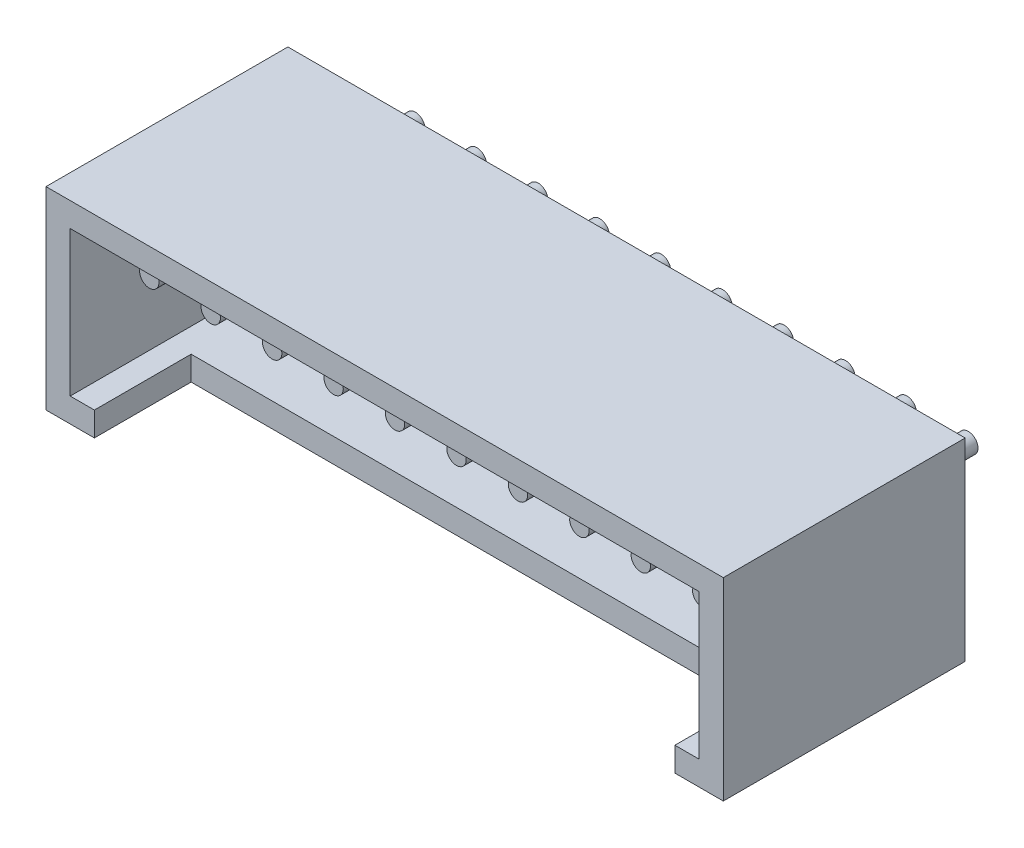
ISO-10303-21;
HEADER;
FILE_DESCRIPTION(('STEP AP214'),'2;1');
FILE_NAME('part.step','',(''),(''),'','','');
FILE_SCHEMA(('AUTOMOTIVE_DESIGN { 1 0 10303 214 1 1 1 1 }'));
ENDSEC;
DATA;
#1=APPLICATION_CONTEXT('core data for automotive mechanical design processes');
#2=APPLICATION_PROTOCOL_DEFINITION('international standard','automotive_design',2000,#1);
#3=PRODUCT_CONTEXT('',#1,'mechanical');
#4=PRODUCT('Part','Part','',(#3));
#5=PRODUCT_RELATED_PRODUCT_CATEGORY('part','',(#4));
#6=PRODUCT_DEFINITION_FORMATION('','',#4);
#7=PRODUCT_DEFINITION_CONTEXT('part definition',#1,'design');
#8=PRODUCT_DEFINITION('design','',#6,#7);
#9=PRODUCT_DEFINITION_SHAPE('','',#8);
#10=(LENGTH_UNIT() NAMED_UNIT(*) SI_UNIT(.MILLI.,.METRE.));
#11=(NAMED_UNIT(*) PLANE_ANGLE_UNIT() SI_UNIT($,.RADIAN.));
#12=(NAMED_UNIT(*) SI_UNIT($,.STERADIAN.) SOLID_ANGLE_UNIT());
#13=UNCERTAINTY_MEASURE_WITH_UNIT(LENGTH_MEASURE(1.E-05),#10,'distance_accuracy_value','');
#14=(GEOMETRIC_REPRESENTATION_CONTEXT(3) GLOBAL_UNCERTAINTY_ASSIGNED_CONTEXT((#13)) GLOBAL_UNIT_ASSIGNED_CONTEXT((#10,
#11,#12)) REPRESENTATION_CONTEXT('',''));
#15=CARTESIAN_POINT('',(0.,0.,0.));
#16=DIRECTION('',(0.,0.,1.));
#17=DIRECTION('',(1.,0.,0.));
#18=AXIS2_PLACEMENT_3D('',#15,#16,#17);
#19=CARTESIAN_POINT('',(12.715,2.6,4.15));
#20=DIRECTION('',(0.,0.,-1.));
#21=DIRECTION('',(-1.,0.,0.));
#22=AXIS2_PLACEMENT_3D('',#19,#20,#21);
#23=CYLINDRICAL_SURFACE('',#22,0.2);
#24=CARTESIAN_POINT('',(12.715,2.6,1.4));
#25=DIRECTION('',(0.,0.,1.));
#26=DIRECTION('',(1.,0.,0.));
#27=AXIS2_PLACEMENT_3D('',#24,#25,#26);
#28=CIRCLE('',#27,0.2);
#29=CARTESIAN_POINT('',(12.915,2.6,1.4));
#30=VERTEX_POINT('',#29);
#31=EDGE_CURVE('E42',#30,#30,#28,.F.);
#32=ORIENTED_EDGE('',*,*,#31,.F.);
#33=EDGE_LOOP('',(#32));
#34=FACE_BOUND('',#33,.T.);
#35=CARTESIAN_POINT('',(12.715,2.6,4.15));
#36=DIRECTION('',(0.,0.,1.));
#37=DIRECTION('',(1.,0.,0.));
#38=AXIS2_PLACEMENT_3D('',#35,#36,#37);
#39=CIRCLE('',#38,0.2);
#40=CARTESIAN_POINT('',(12.915,2.6,4.15));
#41=VERTEX_POINT('',#40);
#42=EDGE_CURVE('E11',#41,#41,#39,.T.);
#43=ORIENTED_EDGE('',*,*,#42,.F.);
#44=EDGE_LOOP('',(#43));
#45=FACE_BOUND('',#44,.T.);
#46=ADVANCED_FACE('F35',(#34,#45),#23,.T.);
#47=CARTESIAN_POINT('',(12.715,2.6,4.15));
#48=DIRECTION('',(0.,0.,1.));
#49=DIRECTION('',(1.,0.,0.));
#50=AXIS2_PLACEMENT_3D('',#47,#48,#49);
#51=PLANE('',#50);
#52=ORIENTED_EDGE('',*,*,#42,.T.);
#53=EDGE_LOOP('',(#52));
#54=FACE_BOUND('',#53,.T.);
#55=ADVANCED_FACE('F279',(#54),#51,.T.);
#56=CARTESIAN_POINT('',(11.445,2.6,4.15));
#57=DIRECTION('',(0.,0.,-1.));
#58=DIRECTION('',(-1.,0.,0.));
#59=AXIS2_PLACEMENT_3D('',#56,#57,#58);
#60=CYLINDRICAL_SURFACE('',#59,0.2);
#61=CARTESIAN_POINT('',(11.445,2.6,1.4));
#62=DIRECTION('',(0.,0.,1.));
#63=DIRECTION('',(1.,0.,0.));
#64=AXIS2_PLACEMENT_3D('',#61,#62,#63);
#65=CIRCLE('',#64,0.2);
#66=CARTESIAN_POINT('',(11.645,2.6,1.4));
#67=VERTEX_POINT('',#66);
#68=EDGE_CURVE('E267',#67,#67,#65,.F.);
#69=ORIENTED_EDGE('',*,*,#68,.F.);
#70=EDGE_LOOP('',(#69));
#71=FACE_BOUND('',#70,.T.);
#72=CARTESIAN_POINT('',(11.445,2.6,4.15));
#73=DIRECTION('',(0.,0.,1.));
#74=DIRECTION('',(1.,0.,0.));
#75=AXIS2_PLACEMENT_3D('',#72,#73,#74);
#76=CIRCLE('',#75,0.2);
#77=CARTESIAN_POINT('',(11.645,2.6,4.15));
#78=VERTEX_POINT('',#77);
#79=EDGE_CURVE('E270',#78,#78,#76,.T.);
#80=ORIENTED_EDGE('',*,*,#79,.F.);
#81=EDGE_LOOP('',(#80));
#82=FACE_BOUND('',#81,.T.);
#83=ADVANCED_FACE('F283',(#71,#82),#60,.T.);
#84=CARTESIAN_POINT('',(11.445,2.6,4.15));
#85=DIRECTION('',(0.,0.,1.));
#86=DIRECTION('',(1.,0.,0.));
#87=AXIS2_PLACEMENT_3D('',#84,#85,#86);
#88=PLANE('',#87);
#89=ORIENTED_EDGE('',*,*,#79,.T.);
#90=EDGE_LOOP('',(#89));
#91=FACE_BOUND('',#90,.T.);
#92=ADVANCED_FACE('F287',(#91),#88,.T.);
#93=CARTESIAN_POINT('',(10.175,2.6,4.15));
#94=DIRECTION('',(0.,0.,-1.));
#95=DIRECTION('',(-1.,0.,0.));
#96=AXIS2_PLACEMENT_3D('',#93,#94,#95);
#97=CYLINDRICAL_SURFACE('',#96,0.2);
#98=CARTESIAN_POINT('',(10.175,2.6,1.4));
#99=DIRECTION('',(0.,0.,1.));
#100=DIRECTION('',(1.,0.,0.));
#101=AXIS2_PLACEMENT_3D('',#98,#99,#100);
#102=CIRCLE('',#101,0.2);
#103=CARTESIAN_POINT('',(10.375,2.6,1.4));
#104=VERTEX_POINT('',#103);
#105=EDGE_CURVE('E261',#104,#104,#102,.F.);
#106=ORIENTED_EDGE('',*,*,#105,.F.);
#107=EDGE_LOOP('',(#106));
#108=FACE_BOUND('',#107,.T.);
#109=CARTESIAN_POINT('',(10.175,2.6,4.15));
#110=DIRECTION('',(0.,0.,1.));
#111=DIRECTION('',(1.,0.,0.));
#112=AXIS2_PLACEMENT_3D('',#109,#110,#111);
#113=CIRCLE('',#112,0.2);
#114=CARTESIAN_POINT('',(10.375,2.6,4.15));
#115=VERTEX_POINT('',#114);
#116=EDGE_CURVE('E264',#115,#115,#113,.T.);
#117=ORIENTED_EDGE('',*,*,#116,.F.);
#118=EDGE_LOOP('',(#117));
#119=FACE_BOUND('',#118,.T.);
#120=ADVANCED_FACE('F293',(#108,#119),#97,.T.);
#121=CARTESIAN_POINT('',(10.175,2.6,4.15));
#122=DIRECTION('',(0.,0.,1.));
#123=DIRECTION('',(1.,0.,0.));
#124=AXIS2_PLACEMENT_3D('',#121,#122,#123);
#125=PLANE('',#124);
#126=ORIENTED_EDGE('',*,*,#116,.T.);
#127=EDGE_LOOP('',(#126));
#128=FACE_BOUND('',#127,.T.);
#129=ADVANCED_FACE('F297',(#128),#125,.T.);
#130=CARTESIAN_POINT('',(8.905,2.6,4.15));
#131=DIRECTION('',(0.,0.,-1.));
#132=DIRECTION('',(-1.,0.,0.));
#133=AXIS2_PLACEMENT_3D('',#130,#131,#132);
#134=CYLINDRICAL_SURFACE('',#133,0.2);
#135=CARTESIAN_POINT('',(8.905,2.6,1.4));
#136=DIRECTION('',(0.,0.,1.));
#137=DIRECTION('',(1.,0.,0.));
#138=AXIS2_PLACEMENT_3D('',#135,#136,#137);
#139=CIRCLE('',#138,0.2);
#140=CARTESIAN_POINT('',(9.105,2.6,1.4));
#141=VERTEX_POINT('',#140);
#142=EDGE_CURVE('E255',#141,#141,#139,.F.);
#143=ORIENTED_EDGE('',*,*,#142,.F.);
#144=EDGE_LOOP('',(#143));
#145=FACE_BOUND('',#144,.T.);
#146=CARTESIAN_POINT('',(8.905,2.6,4.15));
#147=DIRECTION('',(0.,0.,1.));
#148=DIRECTION('',(1.,0.,0.));
#149=AXIS2_PLACEMENT_3D('',#146,#147,#148);
#150=CIRCLE('',#149,0.2);
#151=CARTESIAN_POINT('',(9.105,2.6,4.15));
#152=VERTEX_POINT('',#151);
#153=EDGE_CURVE('E258',#152,#152,#150,.T.);
#154=ORIENTED_EDGE('',*,*,#153,.F.);
#155=EDGE_LOOP('',(#154));
#156=FACE_BOUND('',#155,.T.);
#157=ADVANCED_FACE('F301',(#145,#156),#134,.T.);
#158=CARTESIAN_POINT('',(8.905,2.6,4.15));
#159=DIRECTION('',(0.,0.,1.));
#160=DIRECTION('',(1.,0.,0.));
#161=AXIS2_PLACEMENT_3D('',#158,#159,#160);
#162=PLANE('',#161);
#163=ORIENTED_EDGE('',*,*,#153,.T.);
#164=EDGE_LOOP('',(#163));
#165=FACE_BOUND('',#164,.T.);
#166=ADVANCED_FACE('F305',(#165),#162,.T.);
#167=CARTESIAN_POINT('',(7.635,2.6,4.15));
#168=DIRECTION('',(0.,0.,-1.));
#169=DIRECTION('',(-1.,0.,0.));
#170=AXIS2_PLACEMENT_3D('',#167,#168,#169);
#171=CYLINDRICAL_SURFACE('',#170,0.2);
#172=CARTESIAN_POINT('',(7.635,2.6,1.4));
#173=DIRECTION('',(0.,0.,1.));
#174=DIRECTION('',(1.,0.,0.));
#175=AXIS2_PLACEMENT_3D('',#172,#173,#174);
#176=CIRCLE('',#175,0.2);
#177=CARTESIAN_POINT('',(7.835,2.6,1.4));
#178=VERTEX_POINT('',#177);
#179=EDGE_CURVE('E249',#178,#178,#176,.F.);
#180=ORIENTED_EDGE('',*,*,#179,.F.);
#181=EDGE_LOOP('',(#180));
#182=FACE_BOUND('',#181,.T.);
#183=CARTESIAN_POINT('',(7.635,2.6,4.15));
#184=DIRECTION('',(0.,0.,1.));
#185=DIRECTION('',(1.,0.,0.));
#186=AXIS2_PLACEMENT_3D('',#183,#184,#185);
#187=CIRCLE('',#186,0.2);
#188=CARTESIAN_POINT('',(7.835,2.6,4.15));
#189=VERTEX_POINT('',#188);
#190=EDGE_CURVE('E252',#189,#189,#187,.T.);
#191=ORIENTED_EDGE('',*,*,#190,.F.);
#192=EDGE_LOOP('',(#191));
#193=FACE_BOUND('',#192,.T.);
#194=ADVANCED_FACE('F309',(#182,#193),#171,.T.);
#195=CARTESIAN_POINT('',(7.635,2.6,4.15));
#196=DIRECTION('',(0.,0.,1.));
#197=DIRECTION('',(1.,0.,0.));
#198=AXIS2_PLACEMENT_3D('',#195,#196,#197);
#199=PLANE('',#198);
#200=ORIENTED_EDGE('',*,*,#190,.T.);
#201=EDGE_LOOP('',(#200));
#202=FACE_BOUND('',#201,.T.);
#203=ADVANCED_FACE('F313',(#202),#199,.T.);
#204=CARTESIAN_POINT('',(6.365,2.6,4.15));
#205=DIRECTION('',(0.,0.,-1.));
#206=DIRECTION('',(-1.,0.,0.));
#207=AXIS2_PLACEMENT_3D('',#204,#205,#206);
#208=CYLINDRICAL_SURFACE('',#207,0.2);
#209=CARTESIAN_POINT('',(6.365,2.6,1.4));
#210=DIRECTION('',(0.,0.,1.));
#211=DIRECTION('',(1.,0.,0.));
#212=AXIS2_PLACEMENT_3D('',#209,#210,#211);
#213=CIRCLE('',#212,0.2);
#214=CARTESIAN_POINT('',(6.565,2.6,1.4));
#215=VERTEX_POINT('',#214);
#216=EDGE_CURVE('E243',#215,#215,#213,.F.);
#217=ORIENTED_EDGE('',*,*,#216,.F.);
#218=EDGE_LOOP('',(#217));
#219=FACE_BOUND('',#218,.T.);
#220=CARTESIAN_POINT('',(6.365,2.6,4.15));
#221=DIRECTION('',(0.,0.,1.));
#222=DIRECTION('',(1.,0.,0.));
#223=AXIS2_PLACEMENT_3D('',#220,#221,#222);
#224=CIRCLE('',#223,0.2);
#225=CARTESIAN_POINT('',(6.565,2.6,4.15));
#226=VERTEX_POINT('',#225);
#227=EDGE_CURVE('E246',#226,#226,#224,.T.);
#228=ORIENTED_EDGE('',*,*,#227,.F.);
#229=EDGE_LOOP('',(#228));
#230=FACE_BOUND('',#229,.T.);
#231=ADVANCED_FACE('F317',(#219,#230),#208,.T.);
#232=CARTESIAN_POINT('',(6.365,2.6,4.15));
#233=DIRECTION('',(0.,0.,1.));
#234=DIRECTION('',(1.,0.,0.));
#235=AXIS2_PLACEMENT_3D('',#232,#233,#234);
#236=PLANE('',#235);
#237=ORIENTED_EDGE('',*,*,#227,.T.);
#238=EDGE_LOOP('',(#237));
#239=FACE_BOUND('',#238,.T.);
#240=ADVANCED_FACE('F321',(#239),#236,.T.);
#241=CARTESIAN_POINT('',(5.095,2.6,4.15));
#242=DIRECTION('',(0.,0.,-1.));
#243=DIRECTION('',(-1.,0.,0.));
#244=AXIS2_PLACEMENT_3D('',#241,#242,#243);
#245=CYLINDRICAL_SURFACE('',#244,0.2);
#246=CARTESIAN_POINT('',(5.095,2.6,1.4));
#247=DIRECTION('',(0.,0.,1.));
#248=DIRECTION('',(1.,0.,0.));
#249=AXIS2_PLACEMENT_3D('',#246,#247,#248);
#250=CIRCLE('',#249,0.2);
#251=CARTESIAN_POINT('',(5.295,2.6,1.4));
#252=VERTEX_POINT('',#251);
#253=EDGE_CURVE('E237',#252,#252,#250,.F.);
#254=ORIENTED_EDGE('',*,*,#253,.F.);
#255=EDGE_LOOP('',(#254));
#256=FACE_BOUND('',#255,.T.);
#257=CARTESIAN_POINT('',(5.095,2.6,4.15));
#258=DIRECTION('',(0.,0.,1.));
#259=DIRECTION('',(1.,0.,0.));
#260=AXIS2_PLACEMENT_3D('',#257,#258,#259);
#261=CIRCLE('',#260,0.2);
#262=CARTESIAN_POINT('',(5.295,2.6,4.15));
#263=VERTEX_POINT('',#262);
#264=EDGE_CURVE('E240',#263,#263,#261,.T.);
#265=ORIENTED_EDGE('',*,*,#264,.F.);
#266=EDGE_LOOP('',(#265));
#267=FACE_BOUND('',#266,.T.);
#268=ADVANCED_FACE('F325',(#256,#267),#245,.T.);
#269=CARTESIAN_POINT('',(5.095,2.6,4.15));
#270=DIRECTION('',(0.,0.,1.));
#271=DIRECTION('',(1.,0.,0.));
#272=AXIS2_PLACEMENT_3D('',#269,#270,#271);
#273=PLANE('',#272);
#274=ORIENTED_EDGE('',*,*,#264,.T.);
#275=EDGE_LOOP('',(#274));
#276=FACE_BOUND('',#275,.T.);
#277=ADVANCED_FACE('F329',(#276),#273,.T.);
#278=CARTESIAN_POINT('',(3.825,2.6,4.15));
#279=DIRECTION('',(0.,0.,-1.));
#280=DIRECTION('',(-1.,0.,0.));
#281=AXIS2_PLACEMENT_3D('',#278,#279,#280);
#282=CYLINDRICAL_SURFACE('',#281,0.2);
#283=CARTESIAN_POINT('',(3.825,2.6,1.4));
#284=DIRECTION('',(0.,0.,1.));
#285=DIRECTION('',(1.,0.,0.));
#286=AXIS2_PLACEMENT_3D('',#283,#284,#285);
#287=CIRCLE('',#286,0.2);
#288=CARTESIAN_POINT('',(4.025,2.6,1.4));
#289=VERTEX_POINT('',#288);
#290=EDGE_CURVE('E231',#289,#289,#287,.F.);
#291=ORIENTED_EDGE('',*,*,#290,.F.);
#292=EDGE_LOOP('',(#291));
#293=FACE_BOUND('',#292,.T.);
#294=CARTESIAN_POINT('',(3.825,2.6,4.15));
#295=DIRECTION('',(0.,0.,1.));
#296=DIRECTION('',(1.,0.,0.));
#297=AXIS2_PLACEMENT_3D('',#294,#295,#296);
#298=CIRCLE('',#297,0.2);
#299=CARTESIAN_POINT('',(4.025,2.6,4.15));
#300=VERTEX_POINT('',#299);
#301=EDGE_CURVE('E234',#300,#300,#298,.T.);
#302=ORIENTED_EDGE('',*,*,#301,.F.);
#303=EDGE_LOOP('',(#302));
#304=FACE_BOUND('',#303,.T.);
#305=ADVANCED_FACE('F333',(#293,#304),#282,.T.);
#306=CARTESIAN_POINT('',(3.825,2.6,4.15));
#307=DIRECTION('',(0.,0.,1.));
#308=DIRECTION('',(1.,0.,0.));
#309=AXIS2_PLACEMENT_3D('',#306,#307,#308);
#310=PLANE('',#309);
#311=ORIENTED_EDGE('',*,*,#301,.T.);
#312=EDGE_LOOP('',(#311));
#313=FACE_BOUND('',#312,.T.);
#314=ADVANCED_FACE('F337',(#313),#310,.T.);
#315=CARTESIAN_POINT('',(12.715,2.6,-1.35));
#316=DIRECTION('',(0.,0.,1.));
#317=DIRECTION('',(1.,0.,0.));
#318=AXIS2_PLACEMENT_3D('',#315,#316,#317);
#319=PLANE('',#318);
#320=CARTESIAN_POINT('',(12.715,2.6,-1.35));
#321=DIRECTION('',(0.,0.,1.));
#322=DIRECTION('',(1.,0.,0.));
#323=AXIS2_PLACEMENT_3D('',#320,#321,#322);
#324=CIRCLE('',#323,0.2);
#325=CARTESIAN_POINT('',(12.915,2.6,-1.35));
#326=VERTEX_POINT('',#325);
#327=EDGE_CURVE('E228',#326,#326,#324,.T.);
#328=ORIENTED_EDGE('',*,*,#327,.F.);
#329=EDGE_LOOP('',(#328));
#330=FACE_BOUND('',#329,.T.);
#331=ADVANCED_FACE('F341',(#330),#319,.F.);
#332=CARTESIAN_POINT('',(12.715,2.6,4.15));
#333=DIRECTION('',(0.,0.,-1.));
#334=DIRECTION('',(-1.,0.,0.));
#335=AXIS2_PLACEMENT_3D('',#332,#333,#334);
#336=CYLINDRICAL_SURFACE('',#335,0.2);
#337=CARTESIAN_POINT('',(12.715,2.6,0.));
#338=DIRECTION('',(0.,0.,-1.));
#339=DIRECTION('',(-1.,0.,0.));
#340=AXIS2_PLACEMENT_3D('',#337,#338,#339);
#341=CIRCLE('',#340,0.2);
#342=CARTESIAN_POINT('',(12.515,2.6,0.));
#343=VERTEX_POINT('',#342);
#344=EDGE_CURVE('E225',#343,#343,#341,.F.);
#345=ORIENTED_EDGE('',*,*,#344,.F.);
#346=EDGE_LOOP('',(#345));
#347=FACE_BOUND('',#346,.T.);
#348=ORIENTED_EDGE('',*,*,#327,.T.);
#349=EDGE_LOOP('',(#348));
#350=FACE_BOUND('',#349,.T.);
#351=ADVANCED_FACE('F345',(#347,#350),#336,.T.);
#352=CARTESIAN_POINT('',(11.445,2.6,-1.35));
#353=DIRECTION('',(0.,0.,1.));
#354=DIRECTION('',(1.,0.,0.));
#355=AXIS2_PLACEMENT_3D('',#352,#353,#354);
#356=PLANE('',#355);
#357=CARTESIAN_POINT('',(11.445,2.6,-1.35));
#358=DIRECTION('',(0.,0.,1.));
#359=DIRECTION('',(1.,0.,0.));
#360=AXIS2_PLACEMENT_3D('',#357,#358,#359);
#361=CIRCLE('',#360,0.2);
#362=CARTESIAN_POINT('',(11.645,2.6,-1.35));
#363=VERTEX_POINT('',#362);
#364=EDGE_CURVE('E222',#363,#363,#361,.T.);
#365=ORIENTED_EDGE('',*,*,#364,.F.);
#366=EDGE_LOOP('',(#365));
#367=FACE_BOUND('',#366,.T.);
#368=ADVANCED_FACE('F349',(#367),#356,.F.);
#369=CARTESIAN_POINT('',(11.445,2.6,4.15));
#370=DIRECTION('',(0.,0.,-1.));
#371=DIRECTION('',(-1.,0.,0.));
#372=AXIS2_PLACEMENT_3D('',#369,#370,#371);
#373=CYLINDRICAL_SURFACE('',#372,0.2);
#374=CARTESIAN_POINT('',(11.445,2.6,0.));
#375=DIRECTION('',(0.,0.,-1.));
#376=DIRECTION('',(-1.,0.,0.));
#377=AXIS2_PLACEMENT_3D('',#374,#375,#376);
#378=CIRCLE('',#377,0.2);
#379=CARTESIAN_POINT('',(11.245,2.6,0.));
#380=VERTEX_POINT('',#379);
#381=EDGE_CURVE('E219',#380,#380,#378,.F.);
#382=ORIENTED_EDGE('',*,*,#381,.F.);
#383=EDGE_LOOP('',(#382));
#384=FACE_BOUND('',#383,.T.);
#385=ORIENTED_EDGE('',*,*,#364,.T.);
#386=EDGE_LOOP('',(#385));
#387=FACE_BOUND('',#386,.T.);
#388=ADVANCED_FACE('F353',(#384,#387),#373,.T.);
#389=CARTESIAN_POINT('',(10.175,2.6,-1.35));
#390=DIRECTION('',(0.,0.,1.));
#391=DIRECTION('',(1.,0.,0.));
#392=AXIS2_PLACEMENT_3D('',#389,#390,#391);
#393=PLANE('',#392);
#394=CARTESIAN_POINT('',(10.175,2.6,-1.35));
#395=DIRECTION('',(0.,0.,1.));
#396=DIRECTION('',(1.,0.,0.));
#397=AXIS2_PLACEMENT_3D('',#394,#395,#396);
#398=CIRCLE('',#397,0.2);
#399=CARTESIAN_POINT('',(10.375,2.6,-1.35));
#400=VERTEX_POINT('',#399);
#401=EDGE_CURVE('E216',#400,#400,#398,.T.);
#402=ORIENTED_EDGE('',*,*,#401,.F.);
#403=EDGE_LOOP('',(#402));
#404=FACE_BOUND('',#403,.T.);
#405=ADVANCED_FACE('F357',(#404),#393,.F.);
#406=CARTESIAN_POINT('',(10.175,2.6,4.15));
#407=DIRECTION('',(0.,0.,-1.));
#408=DIRECTION('',(-1.,0.,0.));
#409=AXIS2_PLACEMENT_3D('',#406,#407,#408);
#410=CYLINDRICAL_SURFACE('',#409,0.2);
#411=CARTESIAN_POINT('',(10.175,2.6,0.));
#412=DIRECTION('',(0.,0.,-1.));
#413=DIRECTION('',(-1.,0.,0.));
#414=AXIS2_PLACEMENT_3D('',#411,#412,#413);
#415=CIRCLE('',#414,0.2);
#416=CARTESIAN_POINT('',(9.975,2.6,0.));
#417=VERTEX_POINT('',#416);
#418=EDGE_CURVE('E213',#417,#417,#415,.F.);
#419=ORIENTED_EDGE('',*,*,#418,.F.);
#420=EDGE_LOOP('',(#419));
#421=FACE_BOUND('',#420,.T.);
#422=ORIENTED_EDGE('',*,*,#401,.T.);
#423=EDGE_LOOP('',(#422));
#424=FACE_BOUND('',#423,.T.);
#425=ADVANCED_FACE('F361',(#421,#424),#410,.T.);
#426=CARTESIAN_POINT('',(8.905,2.6,-1.35));
#427=DIRECTION('',(0.,0.,1.));
#428=DIRECTION('',(1.,0.,0.));
#429=AXIS2_PLACEMENT_3D('',#426,#427,#428);
#430=PLANE('',#429);
#431=CARTESIAN_POINT('',(8.905,2.6,-1.35));
#432=DIRECTION('',(0.,0.,1.));
#433=DIRECTION('',(1.,0.,0.));
#434=AXIS2_PLACEMENT_3D('',#431,#432,#433);
#435=CIRCLE('',#434,0.2);
#436=CARTESIAN_POINT('',(9.105,2.6,-1.35));
#437=VERTEX_POINT('',#436);
#438=EDGE_CURVE('E210',#437,#437,#435,.T.);
#439=ORIENTED_EDGE('',*,*,#438,.F.);
#440=EDGE_LOOP('',(#439));
#441=FACE_BOUND('',#440,.T.);
#442=ADVANCED_FACE('F365',(#441),#430,.F.);
#443=CARTESIAN_POINT('',(8.905,2.6,4.15));
#444=DIRECTION('',(0.,0.,-1.));
#445=DIRECTION('',(-1.,0.,0.));
#446=AXIS2_PLACEMENT_3D('',#443,#444,#445);
#447=CYLINDRICAL_SURFACE('',#446,0.2);
#448=CARTESIAN_POINT('',(8.905,2.6,0.));
#449=DIRECTION('',(0.,0.,-1.));
#450=DIRECTION('',(-1.,0.,0.));
#451=AXIS2_PLACEMENT_3D('',#448,#449,#450);
#452=CIRCLE('',#451,0.2);
#453=CARTESIAN_POINT('',(8.705,2.6,0.));
#454=VERTEX_POINT('',#453);
#455=EDGE_CURVE('E207',#454,#454,#452,.F.);
#456=ORIENTED_EDGE('',*,*,#455,.F.);
#457=EDGE_LOOP('',(#456));
#458=FACE_BOUND('',#457,.T.);
#459=ORIENTED_EDGE('',*,*,#438,.T.);
#460=EDGE_LOOP('',(#459));
#461=FACE_BOUND('',#460,.T.);
#462=ADVANCED_FACE('F369',(#458,#461),#447,.T.);
#463=CARTESIAN_POINT('',(7.635,2.6,-1.35));
#464=DIRECTION('',(0.,0.,1.));
#465=DIRECTION('',(1.,0.,0.));
#466=AXIS2_PLACEMENT_3D('',#463,#464,#465);
#467=PLANE('',#466);
#468=CARTESIAN_POINT('',(7.635,2.6,-1.35));
#469=DIRECTION('',(0.,0.,1.));
#470=DIRECTION('',(1.,0.,0.));
#471=AXIS2_PLACEMENT_3D('',#468,#469,#470);
#472=CIRCLE('',#471,0.2);
#473=CARTESIAN_POINT('',(7.835,2.6,-1.35));
#474=VERTEX_POINT('',#473);
#475=EDGE_CURVE('E204',#474,#474,#472,.T.);
#476=ORIENTED_EDGE('',*,*,#475,.F.);
#477=EDGE_LOOP('',(#476));
#478=FACE_BOUND('',#477,.T.);
#479=ADVANCED_FACE('F373',(#478),#467,.F.);
#480=CARTESIAN_POINT('',(7.635,2.6,4.15));
#481=DIRECTION('',(0.,0.,-1.));
#482=DIRECTION('',(-1.,0.,0.));
#483=AXIS2_PLACEMENT_3D('',#480,#481,#482);
#484=CYLINDRICAL_SURFACE('',#483,0.2);
#485=CARTESIAN_POINT('',(7.635,2.6,0.));
#486=DIRECTION('',(0.,0.,-1.));
#487=DIRECTION('',(-1.,0.,0.));
#488=AXIS2_PLACEMENT_3D('',#485,#486,#487);
#489=CIRCLE('',#488,0.2);
#490=CARTESIAN_POINT('',(7.435,2.6,0.));
#491=VERTEX_POINT('',#490);
#492=EDGE_CURVE('E201',#491,#491,#489,.F.);
#493=ORIENTED_EDGE('',*,*,#492,.F.);
#494=EDGE_LOOP('',(#493));
#495=FACE_BOUND('',#494,.T.);
#496=ORIENTED_EDGE('',*,*,#475,.T.);
#497=EDGE_LOOP('',(#496));
#498=FACE_BOUND('',#497,.T.);
#499=ADVANCED_FACE('F377',(#495,#498),#484,.T.);
#500=CARTESIAN_POINT('',(6.365,2.6,-1.35));
#501=DIRECTION('',(0.,0.,1.));
#502=DIRECTION('',(1.,0.,0.));
#503=AXIS2_PLACEMENT_3D('',#500,#501,#502);
#504=PLANE('',#503);
#505=CARTESIAN_POINT('',(6.365,2.6,-1.35));
#506=DIRECTION('',(0.,0.,1.));
#507=DIRECTION('',(1.,0.,0.));
#508=AXIS2_PLACEMENT_3D('',#505,#506,#507);
#509=CIRCLE('',#508,0.2);
#510=CARTESIAN_POINT('',(6.565,2.6,-1.35));
#511=VERTEX_POINT('',#510);
#512=EDGE_CURVE('E198',#511,#511,#509,.T.);
#513=ORIENTED_EDGE('',*,*,#512,.F.);
#514=EDGE_LOOP('',(#513));
#515=FACE_BOUND('',#514,.T.);
#516=ADVANCED_FACE('F381',(#515),#504,.F.);
#517=CARTESIAN_POINT('',(6.365,2.6,4.15));
#518=DIRECTION('',(0.,0.,-1.));
#519=DIRECTION('',(-1.,0.,0.));
#520=AXIS2_PLACEMENT_3D('',#517,#518,#519);
#521=CYLINDRICAL_SURFACE('',#520,0.2);
#522=CARTESIAN_POINT('',(6.365,2.6,0.));
#523=DIRECTION('',(0.,0.,-1.));
#524=DIRECTION('',(-1.,0.,0.));
#525=AXIS2_PLACEMENT_3D('',#522,#523,#524);
#526=CIRCLE('',#525,0.2);
#527=CARTESIAN_POINT('',(6.165,2.6,0.));
#528=VERTEX_POINT('',#527);
#529=EDGE_CURVE('E195',#528,#528,#526,.F.);
#530=ORIENTED_EDGE('',*,*,#529,.F.);
#531=EDGE_LOOP('',(#530));
#532=FACE_BOUND('',#531,.T.);
#533=ORIENTED_EDGE('',*,*,#512,.T.);
#534=EDGE_LOOP('',(#533));
#535=FACE_BOUND('',#534,.T.);
#536=ADVANCED_FACE('F385',(#532,#535),#521,.T.);
#537=CARTESIAN_POINT('',(5.095,2.6,-1.35));
#538=DIRECTION('',(0.,0.,1.));
#539=DIRECTION('',(1.,0.,0.));
#540=AXIS2_PLACEMENT_3D('',#537,#538,#539);
#541=PLANE('',#540);
#542=CARTESIAN_POINT('',(5.095,2.6,-1.35));
#543=DIRECTION('',(0.,0.,1.));
#544=DIRECTION('',(1.,0.,0.));
#545=AXIS2_PLACEMENT_3D('',#542,#543,#544);
#546=CIRCLE('',#545,0.2);
#547=CARTESIAN_POINT('',(5.295,2.6,-1.35));
#548=VERTEX_POINT('',#547);
#549=EDGE_CURVE('E192',#548,#548,#546,.T.);
#550=ORIENTED_EDGE('',*,*,#549,.F.);
#551=EDGE_LOOP('',(#550));
#552=FACE_BOUND('',#551,.T.);
#553=ADVANCED_FACE('F389',(#552),#541,.F.);
#554=CARTESIAN_POINT('',(5.095,2.6,4.15));
#555=DIRECTION('',(0.,0.,-1.));
#556=DIRECTION('',(-1.,0.,0.));
#557=AXIS2_PLACEMENT_3D('',#554,#555,#556);
#558=CYLINDRICAL_SURFACE('',#557,0.2);
#559=CARTESIAN_POINT('',(5.095,2.6,0.));
#560=DIRECTION('',(0.,0.,-1.));
#561=DIRECTION('',(-1.,0.,0.));
#562=AXIS2_PLACEMENT_3D('',#559,#560,#561);
#563=CIRCLE('',#562,0.2);
#564=CARTESIAN_POINT('',(4.895,2.6,0.));
#565=VERTEX_POINT('',#564);
#566=EDGE_CURVE('E189',#565,#565,#563,.F.);
#567=ORIENTED_EDGE('',*,*,#566,.F.);
#568=EDGE_LOOP('',(#567));
#569=FACE_BOUND('',#568,.T.);
#570=ORIENTED_EDGE('',*,*,#549,.T.);
#571=EDGE_LOOP('',(#570));
#572=FACE_BOUND('',#571,.T.);
#573=ADVANCED_FACE('F393',(#569,#572),#558,.T.);
#574=CARTESIAN_POINT('',(3.825,2.6,-1.35));
#575=DIRECTION('',(0.,0.,1.));
#576=DIRECTION('',(1.,0.,0.));
#577=AXIS2_PLACEMENT_3D('',#574,#575,#576);
#578=PLANE('',#577);
#579=CARTESIAN_POINT('',(3.825,2.6,-1.35));
#580=DIRECTION('',(0.,0.,1.));
#581=DIRECTION('',(1.,0.,0.));
#582=AXIS2_PLACEMENT_3D('',#579,#580,#581);
#583=CIRCLE('',#582,0.2);
#584=CARTESIAN_POINT('',(4.025,2.6,-1.35));
#585=VERTEX_POINT('',#584);
#586=EDGE_CURVE('E186',#585,#585,#583,.T.);
#587=ORIENTED_EDGE('',*,*,#586,.F.);
#588=EDGE_LOOP('',(#587));
#589=FACE_BOUND('',#588,.T.);
#590=ADVANCED_FACE('F397',(#589),#578,.F.);
#591=CARTESIAN_POINT('',(3.825,2.6,4.15));
#592=DIRECTION('',(0.,0.,-1.));
#593=DIRECTION('',(-1.,0.,0.));
#594=AXIS2_PLACEMENT_3D('',#591,#592,#593);
#595=CYLINDRICAL_SURFACE('',#594,0.2);
#596=CARTESIAN_POINT('',(3.825,2.6,0.));
#597=DIRECTION('',(0.,0.,-1.));
#598=DIRECTION('',(-1.,0.,0.));
#599=AXIS2_PLACEMENT_3D('',#596,#597,#598);
#600=CIRCLE('',#599,0.2);
#601=CARTESIAN_POINT('',(3.625,2.6,0.));
#602=VERTEX_POINT('',#601);
#603=EDGE_CURVE('E178',#602,#602,#600,.F.);
#604=ORIENTED_EDGE('',*,*,#603,.F.);
#605=EDGE_LOOP('',(#604));
#606=FACE_BOUND('',#605,.T.);
#607=ORIENTED_EDGE('',*,*,#586,.T.);
#608=EDGE_LOOP('',(#607));
#609=FACE_BOUND('',#608,.T.);
#610=ADVANCED_FACE('F401',(#606,#609),#595,.T.);
#611=CARTESIAN_POINT('',(0.,0.,5.));
#612=DIRECTION('',(1.,0.,0.));
#613=DIRECTION('',(0.,0.,-1.));
#614=AXIS2_PLACEMENT_3D('',#611,#612,#613);
#615=PLANE('',#614);
#616=DIRECTION('',(0.,-1.,0.));
#617=VECTOR('',#616,1.);
#618=CARTESIAN_POINT('',(0.,0.,0.));
#619=LINE('',#618,#617);
#620=CARTESIAN_POINT('',(0.,4.,0.));
#621=VERTEX_POINT('',#620);
#622=CARTESIAN_POINT('',(0.,0.,0.));
#623=VERTEX_POINT('',#622);
#624=EDGE_CURVE('E160',#621,#623,#619,.T.);
#625=ORIENTED_EDGE('',*,*,#624,.T.);
#626=DIRECTION('',(0.,0.,-1.));
#627=VECTOR('',#626,1.);
#628=CARTESIAN_POINT('',(0.,0.,5.));
#629=LINE('',#628,#627);
#630=CARTESIAN_POINT('',(0.,0.,5.));
#631=VERTEX_POINT('',#630);
#632=EDGE_CURVE('E175',#631,#623,#629,.T.);
#633=ORIENTED_EDGE('',*,*,#632,.F.);
#634=DIRECTION('',(0.,-1.,0.));
#635=VECTOR('',#634,1.);
#636=CARTESIAN_POINT('',(0.,0.,5.));
#637=LINE('',#636,#635);
#638=CARTESIAN_POINT('',(0.,4.,5.));
#639=VERTEX_POINT('',#638);
#640=EDGE_CURVE('E148',#639,#631,#637,.T.);
#641=ORIENTED_EDGE('',*,*,#640,.F.);
#642=DIRECTION('',(0.,0.,-1.));
#643=VECTOR('',#642,1.);
#644=CARTESIAN_POINT('',(0.,4.,5.));
#645=LINE('',#644,#643);
#646=EDGE_CURVE('E159',#639,#621,#645,.T.);
#647=ORIENTED_EDGE('',*,*,#646,.T.);
#648=EDGE_LOOP('',(#625,#633,#641,#647));
#649=FACE_BOUND('',#648,.T.);
#650=ADVANCED_FACE('F405',(#649),#615,.F.);
#651=CARTESIAN_POINT('',(0.,0.,5.));
#652=DIRECTION('',(0.,1.,0.));
#653=DIRECTION('',(0.,0.,1.));
#654=AXIS2_PLACEMENT_3D('',#651,#652,#653);
#655=PLANE('',#654);
#656=DIRECTION('',(1.,0.,0.));
#657=VECTOR('',#656,1.);
#658=CARTESIAN_POINT('',(1.,0.,3.));
#659=LINE('',#658,#657);
#660=CARTESIAN_POINT('',(1.,0.,3.));
#661=VERTEX_POINT('',#660);
#662=CARTESIAN_POINT('',(13.,0.,3.));
#663=VERTEX_POINT('',#662);
#664=EDGE_CURVE('E513',#661,#663,#659,.T.);
#665=ORIENTED_EDGE('',*,*,#664,.F.);
#666=DIRECTION('',(0.,0.,-1.));
#667=VECTOR('',#666,1.);
#668=CARTESIAN_POINT('',(1.,0.,6.73746184554908));
#669=LINE('',#668,#667);
#670=CARTESIAN_POINT('',(1.,0.,5.));
#671=VERTEX_POINT('',#670);
#672=EDGE_CURVE('E129',#671,#661,#669,.T.);
#673=ORIENTED_EDGE('',*,*,#672,.F.);
#674=DIRECTION('',(1.,0.,0.));
#675=VECTOR('',#674,1.);
#676=CARTESIAN_POINT('',(0.,0.,5.));
#677=LINE('',#676,#675);
#678=EDGE_CURVE('E147',#631,#671,#677,.T.);
#679=ORIENTED_EDGE('',*,*,#678,.F.);
#680=ORIENTED_EDGE('',*,*,#632,.T.);
#681=DIRECTION('',(1.,0.,0.));
#682=VECTOR('',#681,1.);
#683=CARTESIAN_POINT('',(0.,0.,0.));
#684=LINE('',#683,#682);
#685=CARTESIAN_POINT('',(14.,0.,0.));
#686=VERTEX_POINT('',#685);
#687=EDGE_CURVE('E163',#623,#686,#684,.T.);
#688=ORIENTED_EDGE('',*,*,#687,.T.);
#689=DIRECTION('',(0.,0.,-1.));
#690=VECTOR('',#689,1.);
#691=CARTESIAN_POINT('',(14.,0.,5.));
#692=LINE('',#691,#690);
#693=CARTESIAN_POINT('',(14.,0.,5.));
#694=VERTEX_POINT('',#693);
#695=EDGE_CURVE('E145',#694,#686,#692,.T.);
#696=ORIENTED_EDGE('',*,*,#695,.F.);
#697=CARTESIAN_POINT('',(13.,0.,5.));
#698=VERTEX_POINT('',#697);
#699=EDGE_CURVE('E136',#698,#694,#677,.T.);
#700=ORIENTED_EDGE('',*,*,#699,.F.);
#701=DIRECTION('',(0.,0.,1.));
#702=VECTOR('',#701,1.);
#703=CARTESIAN_POINT('',(13.,0.,6.73746184554908));
#704=LINE('',#703,#702);
#705=EDGE_CURVE('E122',#663,#698,#704,.T.);
#706=ORIENTED_EDGE('',*,*,#705,.F.);
#707=EDGE_LOOP('',(#665,#673,#679,#680,#688,#696,#700,#706));
#708=FACE_BOUND('',#707,.T.);
#709=ADVANCED_FACE('F143',(#708),#655,.F.);
#710=CARTESIAN_POINT('',(14.,0.,5.));
#711=DIRECTION('',(-1.,0.,0.));
#712=DIRECTION('',(0.,0.,1.));
#713=AXIS2_PLACEMENT_3D('',#710,#711,#712);
#714=PLANE('',#713);
#715=DIRECTION('',(0.,1.,0.));
#716=VECTOR('',#715,1.);
#717=CARTESIAN_POINT('',(14.,0.,0.));
#718=LINE('',#717,#716);
#719=CARTESIAN_POINT('',(14.,4.,0.));
#720=VERTEX_POINT('',#719);
#721=EDGE_CURVE('E166',#686,#720,#718,.T.);
#722=ORIENTED_EDGE('',*,*,#721,.T.);
#723=DIRECTION('',(0.,0.,-1.));
#724=VECTOR('',#723,1.);
#725=CARTESIAN_POINT('',(14.,4.,5.));
#726=LINE('',#725,#724);
#727=CARTESIAN_POINT('',(14.,4.,5.));
#728=VERTEX_POINT('',#727);
#729=EDGE_CURVE('E171',#728,#720,#726,.T.);
#730=ORIENTED_EDGE('',*,*,#729,.F.);
#731=DIRECTION('',(0.,1.,0.));
#732=VECTOR('',#731,1.);
#733=CARTESIAN_POINT('',(14.,0.,5.));
#734=LINE('',#733,#732);
#735=EDGE_CURVE('E150',#694,#728,#734,.T.);
#736=ORIENTED_EDGE('',*,*,#735,.F.);
#737=ORIENTED_EDGE('',*,*,#695,.T.);
#738=EDGE_LOOP('',(#722,#730,#736,#737));
#739=FACE_BOUND('',#738,.T.);
#740=ADVANCED_FACE('F412',(#739),#714,.F.);
#741=CARTESIAN_POINT('',(0.,4.,5.));
#742=DIRECTION('',(0.,-1.,0.));
#743=DIRECTION('',(0.,0.,-1.));
#744=AXIS2_PLACEMENT_3D('',#741,#742,#743);
#745=PLANE('',#744);
#746=DIRECTION('',(-1.,0.,0.));
#747=VECTOR('',#746,1.);
#748=CARTESIAN_POINT('',(0.,4.,0.));
#749=LINE('',#748,#747);
#750=EDGE_CURVE('E152',#720,#621,#749,.T.);
#751=ORIENTED_EDGE('',*,*,#750,.T.);
#752=ORIENTED_EDGE('',*,*,#646,.F.);
#753=DIRECTION('',(-1.,0.,0.));
#754=VECTOR('',#753,1.);
#755=CARTESIAN_POINT('',(0.,4.,5.));
#756=LINE('',#755,#754);
#757=EDGE_CURVE('E157',#728,#639,#756,.T.);
#758=ORIENTED_EDGE('',*,*,#757,.F.);
#759=ORIENTED_EDGE('',*,*,#729,.T.);
#760=EDGE_LOOP('',(#751,#752,#758,#759));
#761=FACE_BOUND('',#760,.T.);
#762=ADVANCED_FACE('F415',(#761),#745,.F.);
#763=CARTESIAN_POINT('',(0.,0.,5.));
#764=DIRECTION('',(0.,0.,-1.));
#765=DIRECTION('',(-1.,0.,0.));
#766=AXIS2_PLACEMENT_3D('',#763,#764,#765);
#767=PLANE('',#766);
#768=ORIENTED_EDGE('',*,*,#678,.T.);
#769=DIRECTION('',(0.,-1.,0.));
#770=VECTOR('',#769,1.);
#771=CARTESIAN_POINT('',(1.,4.001,5.));
#772=LINE('',#771,#770);
#773=CARTESIAN_POINT('',(1.,0.5,5.));
#774=VERTEX_POINT('',#773);
#775=EDGE_CURVE('E141',#774,#671,#772,.T.);
#776=ORIENTED_EDGE('',*,*,#775,.F.);
#777=DIRECTION('',(1.,0.,0.));
#778=VECTOR('',#777,1.);
#779=CARTESIAN_POINT('',(0.5,0.5,5.));
#780=LINE('',#779,#778);
#781=CARTESIAN_POINT('',(0.5,0.5,5.));
#782=VERTEX_POINT('',#781);
#783=EDGE_CURVE('E538',#782,#774,#780,.T.);
#784=ORIENTED_EDGE('',*,*,#783,.F.);
#785=DIRECTION('',(0.,-1.,0.));
#786=VECTOR('',#785,1.);
#787=CARTESIAN_POINT('',(0.5,3.5,5.));
#788=LINE('',#787,#786);
#789=CARTESIAN_POINT('',(0.5,3.5,5.));
#790=VERTEX_POINT('',#789);
#791=EDGE_CURVE('E535',#790,#782,#788,.T.);
#792=ORIENTED_EDGE('',*,*,#791,.F.);
#793=DIRECTION('',(-1.,0.,0.));
#794=VECTOR('',#793,1.);
#795=CARTESIAN_POINT('',(13.5,3.5,5.));
#796=LINE('',#795,#794);
#797=CARTESIAN_POINT('',(13.5,3.5,5.));
#798=VERTEX_POINT('',#797);
#799=EDGE_CURVE('E57',#798,#790,#796,.T.);
#800=ORIENTED_EDGE('',*,*,#799,.F.);
#801=DIRECTION('',(0.,1.,0.));
#802=VECTOR('',#801,1.);
#803=CARTESIAN_POINT('',(13.5,0.5,5.));
#804=LINE('',#803,#802);
#805=CARTESIAN_POINT('',(13.5,0.5,5.));
#806=VERTEX_POINT('',#805);
#807=EDGE_CURVE('E524',#806,#798,#804,.T.);
#808=ORIENTED_EDGE('',*,*,#807,.F.);
#809=CARTESIAN_POINT('',(13.,0.5,5.));
#810=VERTEX_POINT('',#809);
#811=EDGE_CURVE('E139',#810,#806,#780,.T.);
#812=ORIENTED_EDGE('',*,*,#811,.F.);
#813=DIRECTION('',(0.,1.,0.));
#814=VECTOR('',#813,1.);
#815=CARTESIAN_POINT('',(13.,4.001,5.));
#816=LINE('',#815,#814);
#817=EDGE_CURVE('E49',#698,#810,#816,.T.);
#818=ORIENTED_EDGE('',*,*,#817,.F.);
#819=ORIENTED_EDGE('',*,*,#699,.T.);
#820=ORIENTED_EDGE('',*,*,#735,.T.);
#821=ORIENTED_EDGE('',*,*,#757,.T.);
#822=ORIENTED_EDGE('',*,*,#640,.T.);
#823=EDGE_LOOP('',(#768,#776,#784,#792,#800,#808,#812,#818,#819,#820,#821,#822));
#824=FACE_BOUND('',#823,.T.);
#825=ADVANCED_FACE('F135',(#824),#767,.F.);
#826=CARTESIAN_POINT('',(0.,0.,0.));
#827=DIRECTION('',(0.,0.,-1.));
#828=DIRECTION('',(-1.,0.,0.));
#829=AXIS2_PLACEMENT_3D('',#826,#827,#828);
#830=PLANE('',#829);
#831=CARTESIAN_POINT('',(2.555,2.6,0.));
#832=DIRECTION('',(0.,0.,-1.));
#833=DIRECTION('',(-1.,0.,0.));
#834=AXIS2_PLACEMENT_3D('',#831,#832,#833);
#835=CIRCLE('',#834,0.2);
#836=CARTESIAN_POINT('',(2.355,2.6,0.));
#837=VERTEX_POINT('',#836);
#838=EDGE_CURVE('E491',#837,#837,#835,.F.);
#839=ORIENTED_EDGE('',*,*,#838,.T.);
#840=EDGE_LOOP('',(#839));
#841=FACE_BOUND('',#840,.T.);
#842=CARTESIAN_POINT('',(1.285,2.6,0.));
#843=DIRECTION('',(0.,0.,-1.));
#844=DIRECTION('',(-1.,0.,0.));
#845=AXIS2_PLACEMENT_3D('',#842,#843,#844);
#846=CIRCLE('',#845,0.2);
#847=CARTESIAN_POINT('',(1.085,2.6,0.));
#848=VERTEX_POINT('',#847);
#849=EDGE_CURVE('E182',#848,#848,#846,.F.);
#850=ORIENTED_EDGE('',*,*,#849,.T.);
#851=EDGE_LOOP('',(#850));
#852=FACE_BOUND('',#851,.T.);
#853=ORIENTED_EDGE('',*,*,#624,.F.);
#854=ORIENTED_EDGE('',*,*,#750,.F.);
#855=ORIENTED_EDGE('',*,*,#721,.F.);
#856=ORIENTED_EDGE('',*,*,#687,.F.);
#857=EDGE_LOOP('',(#853,#854,#855,#856));
#858=FACE_BOUND('',#857,.T.);
#859=ORIENTED_EDGE('',*,*,#603,.T.);
#860=EDGE_LOOP('',(#859));
#861=FACE_BOUND('',#860,.T.);
#862=ORIENTED_EDGE('',*,*,#566,.T.);
#863=EDGE_LOOP('',(#862));
#864=FACE_BOUND('',#863,.T.);
#865=ORIENTED_EDGE('',*,*,#529,.T.);
#866=EDGE_LOOP('',(#865));
#867=FACE_BOUND('',#866,.T.);
#868=ORIENTED_EDGE('',*,*,#492,.T.);
#869=EDGE_LOOP('',(#868));
#870=FACE_BOUND('',#869,.T.);
#871=ORIENTED_EDGE('',*,*,#455,.T.);
#872=EDGE_LOOP('',(#871));
#873=FACE_BOUND('',#872,.T.);
#874=ORIENTED_EDGE('',*,*,#418,.T.);
#875=EDGE_LOOP('',(#874));
#876=FACE_BOUND('',#875,.T.);
#877=ORIENTED_EDGE('',*,*,#381,.T.);
#878=EDGE_LOOP('',(#877));
#879=FACE_BOUND('',#878,.T.);
#880=ORIENTED_EDGE('',*,*,#344,.T.);
#881=EDGE_LOOP('',(#880));
#882=FACE_BOUND('',#881,.T.);
#883=ADVANCED_FACE('F420',(#841,#852,#858,#861,#864,#867,#870,#873,#876,#879,#882),#830,.T.);
#884=CARTESIAN_POINT('',(13.5,3.5,1.4));
#885=DIRECTION('',(0.,1.,0.));
#886=DIRECTION('',(0.,0.,1.));
#887=AXIS2_PLACEMENT_3D('',#884,#885,#886);
#888=PLANE('',#887);
#889=ORIENTED_EDGE('',*,*,#799,.T.);
#890=DIRECTION('',(0.,0.,1.));
#891=VECTOR('',#890,1.);
#892=CARTESIAN_POINT('',(0.5,3.5,1.4));
#893=LINE('',#892,#891);
#894=CARTESIAN_POINT('',(0.5,3.5,1.4));
#895=VERTEX_POINT('',#894);
#896=EDGE_CURVE('E533',#895,#790,#893,.T.);
#897=ORIENTED_EDGE('',*,*,#896,.F.);
#898=DIRECTION('',(-1.,0.,0.));
#899=VECTOR('',#898,1.);
#900=CARTESIAN_POINT('',(13.5,3.5,1.4));
#901=LINE('',#900,#899);
#902=CARTESIAN_POINT('',(13.5,3.5,1.4));
#903=VERTEX_POINT('',#902);
#904=EDGE_CURVE('E520',#903,#895,#901,.T.);
#905=ORIENTED_EDGE('',*,*,#904,.F.);
#906=DIRECTION('',(0.,0.,1.));
#907=VECTOR('',#906,1.);
#908=CARTESIAN_POINT('',(13.5,3.5,1.4));
#909=LINE('',#908,#907);
#910=EDGE_CURVE('E164',#903,#798,#909,.T.);
#911=ORIENTED_EDGE('',*,*,#910,.T.);
#912=EDGE_LOOP('',(#889,#897,#905,#911));
#913=FACE_BOUND('',#912,.T.);
#914=ADVANCED_FACE('F423',(#913),#888,.F.);
#915=CARTESIAN_POINT('',(13.5,0.5,1.4));
#916=DIRECTION('',(1.,0.,0.));
#917=DIRECTION('',(0.,0.,-1.));
#918=AXIS2_PLACEMENT_3D('',#915,#916,#917);
#919=PLANE('',#918);
#920=ORIENTED_EDGE('',*,*,#807,.T.);
#921=ORIENTED_EDGE('',*,*,#910,.F.);
#922=DIRECTION('',(0.,1.,0.));
#923=VECTOR('',#922,1.);
#924=CARTESIAN_POINT('',(13.5,0.5,1.4));
#925=LINE('',#924,#923);
#926=CARTESIAN_POINT('',(13.5,0.5,1.4));
#927=VERTEX_POINT('',#926);
#928=EDGE_CURVE('E530',#927,#903,#925,.T.);
#929=ORIENTED_EDGE('',*,*,#928,.F.);
#930=DIRECTION('',(0.,0.,1.));
#931=VECTOR('',#930,1.);
#932=CARTESIAN_POINT('',(13.5,0.5,1.4));
#933=LINE('',#932,#931);
#934=EDGE_CURVE('E544',#927,#806,#933,.T.);
#935=ORIENTED_EDGE('',*,*,#934,.T.);
#936=EDGE_LOOP('',(#920,#921,#929,#935));
#937=FACE_BOUND('',#936,.T.);
#938=ADVANCED_FACE('F429',(#937),#919,.F.);
#939=CARTESIAN_POINT('',(0.5,0.5,1.4));
#940=DIRECTION('',(0.,-1.,0.));
#941=DIRECTION('',(0.,0.,-1.));
#942=AXIS2_PLACEMENT_3D('',#939,#940,#941);
#943=PLANE('',#942);
#944=ORIENTED_EDGE('',*,*,#783,.T.);
#945=DIRECTION('',(0.,0.,1.));
#946=VECTOR('',#945,1.);
#947=CARTESIAN_POINT('',(1.,0.5,6.73746184554908));
#948=LINE('',#947,#946);
#949=CARTESIAN_POINT('',(1.,0.5,3.));
#950=VERTEX_POINT('',#949);
#951=EDGE_CURVE('E517',#950,#774,#948,.T.);
#952=ORIENTED_EDGE('',*,*,#951,.F.);
#953=DIRECTION('',(-1.,0.,0.));
#954=VECTOR('',#953,1.);
#955=CARTESIAN_POINT('',(1.,0.5,3.));
#956=LINE('',#955,#954);
#957=CARTESIAN_POINT('',(13.,0.5,3.));
#958=VERTEX_POINT('',#957);
#959=EDGE_CURVE('E140',#958,#950,#956,.T.);
#960=ORIENTED_EDGE('',*,*,#959,.F.);
#961=DIRECTION('',(0.,0.,-1.));
#962=VECTOR('',#961,1.);
#963=CARTESIAN_POINT('',(13.,0.5,6.73746184554908));
#964=LINE('',#963,#962);
#965=EDGE_CURVE('E130',#810,#958,#964,.T.);
#966=ORIENTED_EDGE('',*,*,#965,.F.);
#967=ORIENTED_EDGE('',*,*,#811,.T.);
#968=ORIENTED_EDGE('',*,*,#934,.F.);
#969=DIRECTION('',(1.,0.,0.));
#970=VECTOR('',#969,1.);
#971=CARTESIAN_POINT('',(0.5,0.5,1.4));
#972=LINE('',#971,#970);
#973=CARTESIAN_POINT('',(0.5,0.5,1.4));
#974=VERTEX_POINT('',#973);
#975=EDGE_CURVE('E527',#974,#927,#972,.T.);
#976=ORIENTED_EDGE('',*,*,#975,.F.);
#977=DIRECTION('',(0.,0.,1.));
#978=VECTOR('',#977,1.);
#979=CARTESIAN_POINT('',(0.5,0.5,1.4));
#980=LINE('',#979,#978);
#981=EDGE_CURVE('E547',#974,#782,#980,.T.);
#982=ORIENTED_EDGE('',*,*,#981,.T.);
#983=EDGE_LOOP('',(#944,#952,#960,#966,#967,#968,#976,#982));
#984=FACE_BOUND('',#983,.T.);
#985=ADVANCED_FACE('F433',(#984),#943,.F.);
#986=CARTESIAN_POINT('',(0.5,3.5,1.4));
#987=DIRECTION('',(-1.,0.,0.));
#988=DIRECTION('',(0.,0.,1.));
#989=AXIS2_PLACEMENT_3D('',#986,#987,#988);
#990=PLANE('',#989);
#991=ORIENTED_EDGE('',*,*,#791,.T.);
#992=ORIENTED_EDGE('',*,*,#981,.F.);
#993=DIRECTION('',(0.,-1.,0.));
#994=VECTOR('',#993,1.);
#995=CARTESIAN_POINT('',(0.5,3.5,1.4));
#996=LINE('',#995,#994);
#997=EDGE_CURVE('E523',#895,#974,#996,.T.);
#998=ORIENTED_EDGE('',*,*,#997,.F.);
#999=ORIENTED_EDGE('',*,*,#896,.T.);
#1000=EDGE_LOOP('',(#991,#992,#998,#999));
#1001=FACE_BOUND('',#1000,.T.);
#1002=ADVANCED_FACE('F430',(#1001),#990,.F.);
#1003=CARTESIAN_POINT('',(0.,0.,1.4));
#1004=DIRECTION('',(0.,0.,1.));
#1005=DIRECTION('',(1.,0.,0.));
#1006=AXIS2_PLACEMENT_3D('',#1003,#1004,#1005);
#1007=PLANE('',#1006);
#1008=CARTESIAN_POINT('',(2.555,2.6,1.4));
#1009=DIRECTION('',(0.,0.,1.));
#1010=DIRECTION('',(1.,0.,0.));
#1011=AXIS2_PLACEMENT_3D('',#1008,#1009,#1010);
#1012=CIRCLE('',#1011,0.2);
#1013=CARTESIAN_POINT('',(2.755,2.6,1.4));
#1014=VERTEX_POINT('',#1013);
#1015=EDGE_CURVE('E487',#1014,#1014,#1012,.F.);
#1016=ORIENTED_EDGE('',*,*,#1015,.T.);
#1017=EDGE_LOOP('',(#1016));
#1018=FACE_BOUND('',#1017,.T.);
#1019=CARTESIAN_POINT('',(1.285,2.6,1.4));
#1020=DIRECTION('',(0.,0.,1.));
#1021=DIRECTION('',(1.,0.,0.));
#1022=AXIS2_PLACEMENT_3D('',#1019,#1020,#1021);
#1023=CIRCLE('',#1022,0.2);
#1024=CARTESIAN_POINT('',(1.485,2.6,1.4));
#1025=VERTEX_POINT('',#1024);
#1026=EDGE_CURVE('E179',#1025,#1025,#1023,.F.);
#1027=ORIENTED_EDGE('',*,*,#1026,.T.);
#1028=EDGE_LOOP('',(#1027));
#1029=FACE_BOUND('',#1028,.T.);
#1030=ORIENTED_EDGE('',*,*,#904,.T.);
#1031=ORIENTED_EDGE('',*,*,#997,.T.);
#1032=ORIENTED_EDGE('',*,*,#975,.T.);
#1033=ORIENTED_EDGE('',*,*,#928,.T.);
#1034=EDGE_LOOP('',(#1030,#1031,#1032,#1033));
#1035=FACE_BOUND('',#1034,.T.);
#1036=ORIENTED_EDGE('',*,*,#290,.T.);
#1037=EDGE_LOOP('',(#1036));
#1038=FACE_BOUND('',#1037,.T.);
#1039=ORIENTED_EDGE('',*,*,#253,.T.);
#1040=EDGE_LOOP('',(#1039));
#1041=FACE_BOUND('',#1040,.T.);
#1042=ORIENTED_EDGE('',*,*,#216,.T.);
#1043=EDGE_LOOP('',(#1042));
#1044=FACE_BOUND('',#1043,.T.);
#1045=ORIENTED_EDGE('',*,*,#179,.T.);
#1046=EDGE_LOOP('',(#1045));
#1047=FACE_BOUND('',#1046,.T.);
#1048=ORIENTED_EDGE('',*,*,#142,.T.);
#1049=EDGE_LOOP('',(#1048));
#1050=FACE_BOUND('',#1049,.T.);
#1051=ORIENTED_EDGE('',*,*,#105,.T.);
#1052=EDGE_LOOP('',(#1051));
#1053=FACE_BOUND('',#1052,.T.);
#1054=ORIENTED_EDGE('',*,*,#68,.T.);
#1055=EDGE_LOOP('',(#1054));
#1056=FACE_BOUND('',#1055,.T.);
#1057=ORIENTED_EDGE('',*,*,#31,.T.);
#1058=EDGE_LOOP('',(#1057));
#1059=FACE_BOUND('',#1058,.T.);
#1060=ADVANCED_FACE('F275',(#1018,#1029,#1035,#1038,#1041,#1044,#1047,#1050,#1053,#1056,#1059),
#1007,.T.);
#1061=CARTESIAN_POINT('',(1.,4.001,6.73746184554908));
#1062=DIRECTION('',(-1.,0.,0.));
#1063=DIRECTION('',(0.,0.,1.));
#1064=AXIS2_PLACEMENT_3D('',#1061,#1062,#1063);
#1065=PLANE('',#1064);
#1066=ORIENTED_EDGE('',*,*,#775,.T.);
#1067=ORIENTED_EDGE('',*,*,#672,.T.);
#1068=DIRECTION('',(0.,-1.,0.));
#1069=VECTOR('',#1068,1.);
#1070=CARTESIAN_POINT('',(1.,4.001,3.));
#1071=LINE('',#1070,#1069);
#1072=EDGE_CURVE('E515',#950,#661,#1071,.T.);
#1073=ORIENTED_EDGE('',*,*,#1072,.F.);
#1074=ORIENTED_EDGE('',*,*,#951,.T.);
#1075=EDGE_LOOP('',(#1066,#1067,#1073,#1074));
#1076=FACE_BOUND('',#1075,.T.);
#1077=ADVANCED_FACE('F443',(#1076),#1065,.F.);
#1078=CARTESIAN_POINT('',(1.,4.001,3.));
#1079=DIRECTION('',(0.,0.,-1.));
#1080=DIRECTION('',(-1.,0.,0.));
#1081=AXIS2_PLACEMENT_3D('',#1078,#1079,#1080);
#1082=PLANE('',#1081);
#1083=ORIENTED_EDGE('',*,*,#959,.T.);
#1084=ORIENTED_EDGE('',*,*,#1072,.T.);
#1085=ORIENTED_EDGE('',*,*,#664,.T.);
#1086=DIRECTION('',(0.,-1.,0.));
#1087=VECTOR('',#1086,1.);
#1088=CARTESIAN_POINT('',(13.,4.001,3.));
#1089=LINE('',#1088,#1087);
#1090=EDGE_CURVE('E124',#958,#663,#1089,.T.);
#1091=ORIENTED_EDGE('',*,*,#1090,.F.);
#1092=EDGE_LOOP('',(#1083,#1084,#1085,#1091));
#1093=FACE_BOUND('',#1092,.T.);
#1094=ADVANCED_FACE('F448',(#1093),#1082,.F.);
#1095=CARTESIAN_POINT('',(13.,4.001,6.73746184554908));
#1096=DIRECTION('',(1.,0.,0.));
#1097=DIRECTION('',(0.,0.,-1.));
#1098=AXIS2_PLACEMENT_3D('',#1095,#1096,#1097);
#1099=PLANE('',#1098);
#1100=ORIENTED_EDGE('',*,*,#817,.T.);
#1101=ORIENTED_EDGE('',*,*,#965,.T.);
#1102=ORIENTED_EDGE('',*,*,#1090,.T.);
#1103=ORIENTED_EDGE('',*,*,#705,.T.);
#1104=EDGE_LOOP('',(#1100,#1101,#1102,#1103));
#1105=FACE_BOUND('',#1104,.T.);
#1106=ADVANCED_FACE('F123',(#1105),#1099,.F.);
#1107=CARTESIAN_POINT('',(1.285,2.6,4.15));
#1108=DIRECTION('',(0.,0.,1.));
#1109=DIRECTION('',(1.,0.,0.));
#1110=AXIS2_PLACEMENT_3D('',#1107,#1108,#1109);
#1111=PLANE('',#1110);
#1112=CARTESIAN_POINT('',(1.285,2.6,4.15));
#1113=DIRECTION('',(0.,0.,1.));
#1114=DIRECTION('',(1.,0.,0.));
#1115=AXIS2_PLACEMENT_3D('',#1112,#1113,#1114);
#1116=CIRCLE('',#1115,0.2);
#1117=CARTESIAN_POINT('',(1.485,2.6,4.15));
#1118=VERTEX_POINT('',#1117);
#1119=EDGE_CURVE('E183',#1118,#1118,#1116,.T.);
#1120=ORIENTED_EDGE('',*,*,#1119,.T.);
#1121=EDGE_LOOP('',(#1120));
#1122=FACE_BOUND('',#1121,.T.);
#1123=ADVANCED_FACE('F447',(#1122),#1111,.T.);
#1124=CARTESIAN_POINT('',(1.285,2.6,4.15));
#1125=DIRECTION('',(0.,0.,-1.));
#1126=DIRECTION('',(-1.,0.,0.));
#1127=AXIS2_PLACEMENT_3D('',#1124,#1125,#1126);
#1128=CYLINDRICAL_SURFACE('',#1127,0.2);
#1129=ORIENTED_EDGE('',*,*,#1026,.F.);
#1130=EDGE_LOOP('',(#1129));
#1131=FACE_BOUND('',#1130,.T.);
#1132=ORIENTED_EDGE('',*,*,#1119,.F.);
#1133=EDGE_LOOP('',(#1132));
#1134=FACE_BOUND('',#1133,.T.);
#1135=ADVANCED_FACE('F455',(#1131,#1134),#1128,.T.);
#1136=ORIENTED_EDGE('',*,*,#849,.F.);
#1137=EDGE_LOOP('',(#1136));
#1138=FACE_BOUND('',#1137,.T.);
#1139=CARTESIAN_POINT('',(1.285,2.6,-1.35));
#1140=DIRECTION('',(0.,0.,1.));
#1141=DIRECTION('',(1.,0.,0.));
#1142=AXIS2_PLACEMENT_3D('',#1139,#1140,#1141);
#1143=CIRCLE('',#1142,0.2);
#1144=CARTESIAN_POINT('',(1.485,2.6,-1.35));
#1145=VERTEX_POINT('',#1144);
#1146=EDGE_CURVE('E500',#1145,#1145,#1143,.T.);
#1147=ORIENTED_EDGE('',*,*,#1146,.T.);
#1148=EDGE_LOOP('',(#1147));
#1149=FACE_BOUND('',#1148,.T.);
#1150=ADVANCED_FACE('F458',(#1138,#1149),#1128,.T.);
#1151=CARTESIAN_POINT('',(1.285,2.6,-1.35));
#1152=DIRECTION('',(0.,0.,1.));
#1153=DIRECTION('',(1.,0.,0.));
#1154=AXIS2_PLACEMENT_3D('',#1151,#1152,#1153);
#1155=PLANE('',#1154);
#1156=ORIENTED_EDGE('',*,*,#1146,.F.);
#1157=EDGE_LOOP('',(#1156));
#1158=FACE_BOUND('',#1157,.T.);
#1159=ADVANCED_FACE('F460',(#1158),#1155,.F.);
#1160=CARTESIAN_POINT('',(2.555,2.6,4.15));
#1161=DIRECTION('',(0.,0.,-1.));
#1162=DIRECTION('',(-1.,0.,0.));
#1163=AXIS2_PLACEMENT_3D('',#1160,#1161,#1162);
#1164=CYLINDRICAL_SURFACE('',#1163,0.2);
#1165=ORIENTED_EDGE('',*,*,#838,.F.);
#1166=EDGE_LOOP('',(#1165));
#1167=FACE_BOUND('',#1166,.T.);
#1168=CARTESIAN_POINT('',(2.555,2.6,-1.35));
#1169=DIRECTION('',(0.,0.,1.));
#1170=DIRECTION('',(1.,0.,0.));
#1171=AXIS2_PLACEMENT_3D('',#1168,#1169,#1170);
#1172=CIRCLE('',#1171,0.2);
#1173=CARTESIAN_POINT('',(2.755,2.6,-1.35));
#1174=VERTEX_POINT('',#1173);
#1175=EDGE_CURVE('E494',#1174,#1174,#1172,.T.);
#1176=ORIENTED_EDGE('',*,*,#1175,.T.);
#1177=EDGE_LOOP('',(#1176));
#1178=FACE_BOUND('',#1177,.T.);
#1179=ADVANCED_FACE('F463',(#1167,#1178),#1164,.T.);
#1180=CARTESIAN_POINT('',(2.555,2.6,-1.35));
#1181=DIRECTION('',(0.,0.,1.));
#1182=DIRECTION('',(1.,0.,0.));
#1183=AXIS2_PLACEMENT_3D('',#1180,#1181,#1182);
#1184=PLANE('',#1183);
#1185=ORIENTED_EDGE('',*,*,#1175,.F.);
#1186=EDGE_LOOP('',(#1185));
#1187=FACE_BOUND('',#1186,.T.);
#1188=ADVANCED_FACE('F470',(#1187),#1184,.F.);
#1189=CARTESIAN_POINT('',(2.555,2.6,4.15));
#1190=DIRECTION('',(0.,0.,1.));
#1191=DIRECTION('',(1.,0.,0.));
#1192=AXIS2_PLACEMENT_3D('',#1189,#1190,#1191);
#1193=PLANE('',#1192);
#1194=CARTESIAN_POINT('',(2.555,2.6,4.15));
#1195=DIRECTION('',(0.,0.,1.));
#1196=DIRECTION('',(1.,0.,0.));
#1197=AXIS2_PLACEMENT_3D('',#1194,#1195,#1196);
#1198=CIRCLE('',#1197,0.2);
#1199=CARTESIAN_POINT('',(2.755,2.6,4.15));
#1200=VERTEX_POINT('',#1199);
#1201=EDGE_CURVE('E490',#1200,#1200,#1198,.T.);
#1202=ORIENTED_EDGE('',*,*,#1201,.T.);
#1203=EDGE_LOOP('',(#1202));
#1204=FACE_BOUND('',#1203,.T.);
#1205=ADVANCED_FACE('F474',(#1204),#1193,.T.);
#1206=CARTESIAN_POINT('',(2.555,2.6,4.15));
#1207=DIRECTION('',(0.,0.,-1.));
#1208=DIRECTION('',(-1.,0.,0.));
#1209=AXIS2_PLACEMENT_3D('',#1206,#1207,#1208);
#1210=CYLINDRICAL_SURFACE('',#1209,0.2);
#1211=ORIENTED_EDGE('',*,*,#1015,.F.);
#1212=EDGE_LOOP('',(#1211));
#1213=FACE_BOUND('',#1212,.T.);
#1214=ORIENTED_EDGE('',*,*,#1201,.F.);
#1215=EDGE_LOOP('',(#1214));
#1216=FACE_BOUND('',#1215,.T.);
#1217=ADVANCED_FACE('F478',(#1213,#1216),#1210,.T.);
#1218=CLOSED_SHELL('',(#46,#55,#83,#92,#120,#129,#157,#166,#194,#203,#231,#240,#268,#277,#305,
#314,#331,#351,#368,#388,#405,#425,#442,#462,#479,#499,#516,#536,#553,#573,#590,#610,#650,#709,
#740,#762,#825,#883,#914,#938,#985,#1002,#1060,#1077,#1094,#1106,#1123,#1135,#1150,#1159,#1179,
#1188,#1205,#1217));
#1219=MANIFOLD_SOLID_BREP('B2',#1218);
#1220=ADVANCED_BREP_SHAPE_REPRESENTATION('',(#18,#1219),#14);
#1221=SHAPE_DEFINITION_REPRESENTATION(#9,#1220);
ENDSEC;
END-ISO-10303-21;
